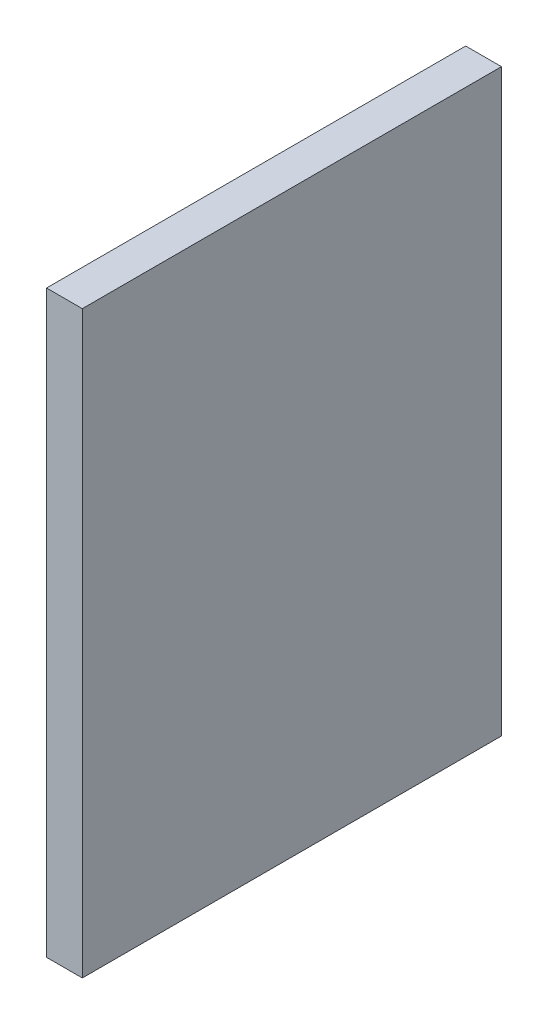
ISO-10303-21;
HEADER;
FILE_DESCRIPTION(('STEP AP214'),'2;1');
FILE_NAME('part.step','',(''),(''),'','','');
FILE_SCHEMA(('AUTOMOTIVE_DESIGN { 1 0 10303 214 1 1 1 1 }'));
ENDSEC;
DATA;
#1=APPLICATION_CONTEXT('core data for automotive mechanical design processes');
#2=APPLICATION_PROTOCOL_DEFINITION('international standard','automotive_design',2000,#1);
#3=PRODUCT_CONTEXT('',#1,'mechanical');
#4=PRODUCT('Part','Part','',(#3));
#5=PRODUCT_RELATED_PRODUCT_CATEGORY('part','',(#4));
#6=PRODUCT_DEFINITION_FORMATION('','',#4);
#7=PRODUCT_DEFINITION_CONTEXT('part definition',#1,'design');
#8=PRODUCT_DEFINITION('design','',#6,#7);
#9=PRODUCT_DEFINITION_SHAPE('','',#8);
#10=(LENGTH_UNIT() NAMED_UNIT(*) SI_UNIT(.MILLI.,.METRE.));
#11=(NAMED_UNIT(*) PLANE_ANGLE_UNIT() SI_UNIT($,.RADIAN.));
#12=(NAMED_UNIT(*) SI_UNIT($,.STERADIAN.) SOLID_ANGLE_UNIT());
#13=UNCERTAINTY_MEASURE_WITH_UNIT(LENGTH_MEASURE(1.E-05),#10,'distance_accuracy_value','');
#14=(GEOMETRIC_REPRESENTATION_CONTEXT(3) GLOBAL_UNCERTAINTY_ASSIGNED_CONTEXT((#13)) GLOBAL_UNIT_ASSIGNED_CONTEXT((#10,
#11,#12)) REPRESENTATION_CONTEXT('',''));
#15=CARTESIAN_POINT('',(0.,0.,0.));
#16=DIRECTION('',(0.,0.,1.));
#17=DIRECTION('',(1.,0.,0.));
#18=AXIS2_PLACEMENT_3D('',#15,#16,#17);
#19=CARTESIAN_POINT('',(4.3,34.85,-25.2));
#20=DIRECTION('',(0.,0.,1.));
#21=DIRECTION('',(0.,-1.,0.));
#22=AXIS2_PLACEMENT_3D('',#19,#20,#21);
#23=PLANE('',#22);
#24=DIRECTION('',(0.,1.,0.));
#25=VECTOR('',#24,1.);
#26=CARTESIAN_POINT('',(0.,34.85,-25.2));
#27=LINE('',#26,#25);
#28=CARTESIAN_POINT('',(0.,-34.85,-25.2));
#29=VERTEX_POINT('',#28);
#30=CARTESIAN_POINT('',(0.,34.85,-25.2));
#31=VERTEX_POINT('',#30);
#32=EDGE_CURVE('E106',#29,#31,#27,.T.);
#33=ORIENTED_EDGE('',*,*,#32,.T.);
#34=DIRECTION('',(-1.,0.,0.));
#35=VECTOR('',#34,1.);
#36=CARTESIAN_POINT('',(4.3,34.85,-25.2));
#37=LINE('',#36,#35);
#38=CARTESIAN_POINT('',(4.3,34.85,-25.2));
#39=VERTEX_POINT('',#38);
#40=EDGE_CURVE('E11',#39,#31,#37,.T.);
#41=ORIENTED_EDGE('',*,*,#40,.F.);
#42=DIRECTION('',(0.,1.,0.));
#43=VECTOR('',#42,1.);
#44=CARTESIAN_POINT('',(4.3,34.85,-25.2));
#45=LINE('',#44,#43);
#46=CARTESIAN_POINT('',(4.3,-34.85,-25.2));
#47=VERTEX_POINT('',#46);
#48=EDGE_CURVE('E94',#47,#39,#45,.T.);
#49=ORIENTED_EDGE('',*,*,#48,.F.);
#50=DIRECTION('',(-1.,0.,0.));
#51=VECTOR('',#50,1.);
#52=CARTESIAN_POINT('',(4.3,-34.85,-25.2));
#53=LINE('',#52,#51);
#54=EDGE_CURVE('E102',#47,#29,#53,.T.);
#55=ORIENTED_EDGE('',*,*,#54,.T.);
#56=EDGE_LOOP('',(#33,#41,#49,#55));
#57=FACE_BOUND('',#56,.T.);
#58=ADVANCED_FACE('F43',(#57),#23,.F.);
#59=CARTESIAN_POINT('',(4.3,34.85,25.2));
#60=DIRECTION('',(0.,-1.,0.));
#61=DIRECTION('',(0.,0.,-1.));
#62=AXIS2_PLACEMENT_3D('',#59,#60,#61);
#63=PLANE('',#62);
#64=DIRECTION('',(0.,0.,1.));
#65=VECTOR('',#64,1.);
#66=CARTESIAN_POINT('',(0.,34.85,25.2));
#67=LINE('',#66,#65);
#68=CARTESIAN_POINT('',(0.,34.85,25.2));
#69=VERTEX_POINT('',#68);
#70=EDGE_CURVE('E98',#31,#69,#67,.T.);
#71=ORIENTED_EDGE('',*,*,#70,.T.);
#72=DIRECTION('',(-1.,0.,0.));
#73=VECTOR('',#72,1.);
#74=CARTESIAN_POINT('',(4.3,34.85,25.2));
#75=LINE('',#74,#73);
#76=CARTESIAN_POINT('',(4.3,34.85,25.2));
#77=VERTEX_POINT('',#76);
#78=EDGE_CURVE('E51',#77,#69,#75,.T.);
#79=ORIENTED_EDGE('',*,*,#78,.F.);
#80=DIRECTION('',(0.,0.,1.));
#81=VECTOR('',#80,1.);
#82=CARTESIAN_POINT('',(4.3,34.85,25.2));
#83=LINE('',#82,#81);
#84=EDGE_CURVE('E89',#39,#77,#83,.T.);
#85=ORIENTED_EDGE('',*,*,#84,.F.);
#86=ORIENTED_EDGE('',*,*,#40,.T.);
#87=EDGE_LOOP('',(#71,#79,#85,#86));
#88=FACE_BOUND('',#87,.T.);
#89=ADVANCED_FACE('F97',(#88),#63,.F.);
#90=CARTESIAN_POINT('',(4.3,34.85,25.2));
#91=DIRECTION('',(0.,0.,-1.));
#92=DIRECTION('',(0.,1.,0.));
#93=AXIS2_PLACEMENT_3D('',#90,#91,#92);
#94=PLANE('',#93);
#95=DIRECTION('',(0.,-1.,0.));
#96=VECTOR('',#95,1.);
#97=CARTESIAN_POINT('',(0.,34.85,25.2));
#98=LINE('',#97,#96);
#99=CARTESIAN_POINT('',(0.,-34.85,25.2));
#100=VERTEX_POINT('',#99);
#101=EDGE_CURVE('E76',#69,#100,#98,.T.);
#102=ORIENTED_EDGE('',*,*,#101,.T.);
#103=DIRECTION('',(-1.,0.,0.));
#104=VECTOR('',#103,1.);
#105=CARTESIAN_POINT('',(4.3,-34.85,25.2));
#106=LINE('',#105,#104);
#107=CARTESIAN_POINT('',(4.3,-34.85,25.2));
#108=VERTEX_POINT('',#107);
#109=EDGE_CURVE('E99',#108,#100,#106,.T.);
#110=ORIENTED_EDGE('',*,*,#109,.F.);
#111=DIRECTION('',(0.,-1.,0.));
#112=VECTOR('',#111,1.);
#113=CARTESIAN_POINT('',(4.3,34.85,25.2));
#114=LINE('',#113,#112);
#115=EDGE_CURVE('E92',#77,#108,#114,.T.);
#116=ORIENTED_EDGE('',*,*,#115,.F.);
#117=ORIENTED_EDGE('',*,*,#78,.T.);
#118=EDGE_LOOP('',(#102,#110,#116,#117));
#119=FACE_BOUND('',#118,.T.);
#120=ADVANCED_FACE('F100',(#119),#94,.F.);
#121=CARTESIAN_POINT('',(4.3,-34.85,25.2));
#122=DIRECTION('',(0.,1.,0.));
#123=DIRECTION('',(0.,0.,1.));
#124=AXIS2_PLACEMENT_3D('',#121,#122,#123);
#125=PLANE('',#124);
#126=DIRECTION('',(0.,0.,-1.));
#127=VECTOR('',#126,1.);
#128=CARTESIAN_POINT('',(0.,-34.85,25.2));
#129=LINE('',#128,#127);
#130=EDGE_CURVE('E82',#100,#29,#129,.T.);
#131=ORIENTED_EDGE('',*,*,#130,.T.);
#132=ORIENTED_EDGE('',*,*,#54,.F.);
#133=DIRECTION('',(0.,0.,-1.));
#134=VECTOR('',#133,1.);
#135=CARTESIAN_POINT('',(4.3,-34.85,25.2));
#136=LINE('',#135,#134);
#137=EDGE_CURVE('E59',#108,#47,#136,.T.);
#138=ORIENTED_EDGE('',*,*,#137,.F.);
#139=ORIENTED_EDGE('',*,*,#109,.T.);
#140=EDGE_LOOP('',(#131,#132,#138,#139));
#141=FACE_BOUND('',#140,.T.);
#142=ADVANCED_FACE('F113',(#141),#125,.F.);
#143=CARTESIAN_POINT('',(4.3,0.,0.));
#144=DIRECTION('',(1.,0.,0.));
#145=DIRECTION('',(0.,0.,-1.));
#146=AXIS2_PLACEMENT_3D('',#143,#144,#145);
#147=PLANE('',#146);
#148=ORIENTED_EDGE('',*,*,#48,.T.);
#149=ORIENTED_EDGE('',*,*,#84,.T.);
#150=ORIENTED_EDGE('',*,*,#115,.T.);
#151=ORIENTED_EDGE('',*,*,#137,.T.);
#152=EDGE_LOOP('',(#148,#149,#150,#151));
#153=FACE_BOUND('',#152,.T.);
#154=ADVANCED_FACE('F90',(#153),#147,.T.);
#155=CARTESIAN_POINT('',(0.,0.,0.));
#156=DIRECTION('',(1.,0.,0.));
#157=DIRECTION('',(0.,0.,-1.));
#158=AXIS2_PLACEMENT_3D('',#155,#156,#157);
#159=PLANE('',#158);
#160=ORIENTED_EDGE('',*,*,#32,.F.);
#161=ORIENTED_EDGE('',*,*,#130,.F.);
#162=ORIENTED_EDGE('',*,*,#101,.F.);
#163=ORIENTED_EDGE('',*,*,#70,.F.);
#164=EDGE_LOOP('',(#160,#161,#162,#163));
#165=FACE_BOUND('',#164,.T.);
#166=ADVANCED_FACE('F116',(#165),#159,.F.);
#167=CLOSED_SHELL('',(#58,#89,#120,#142,#154,#166));
#168=MANIFOLD_SOLID_BREP('B2',#167);
#169=ADVANCED_BREP_SHAPE_REPRESENTATION('',(#18,#168),#14);
#170=SHAPE_DEFINITION_REPRESENTATION(#9,#169);
ENDSEC;
END-ISO-10303-21;
